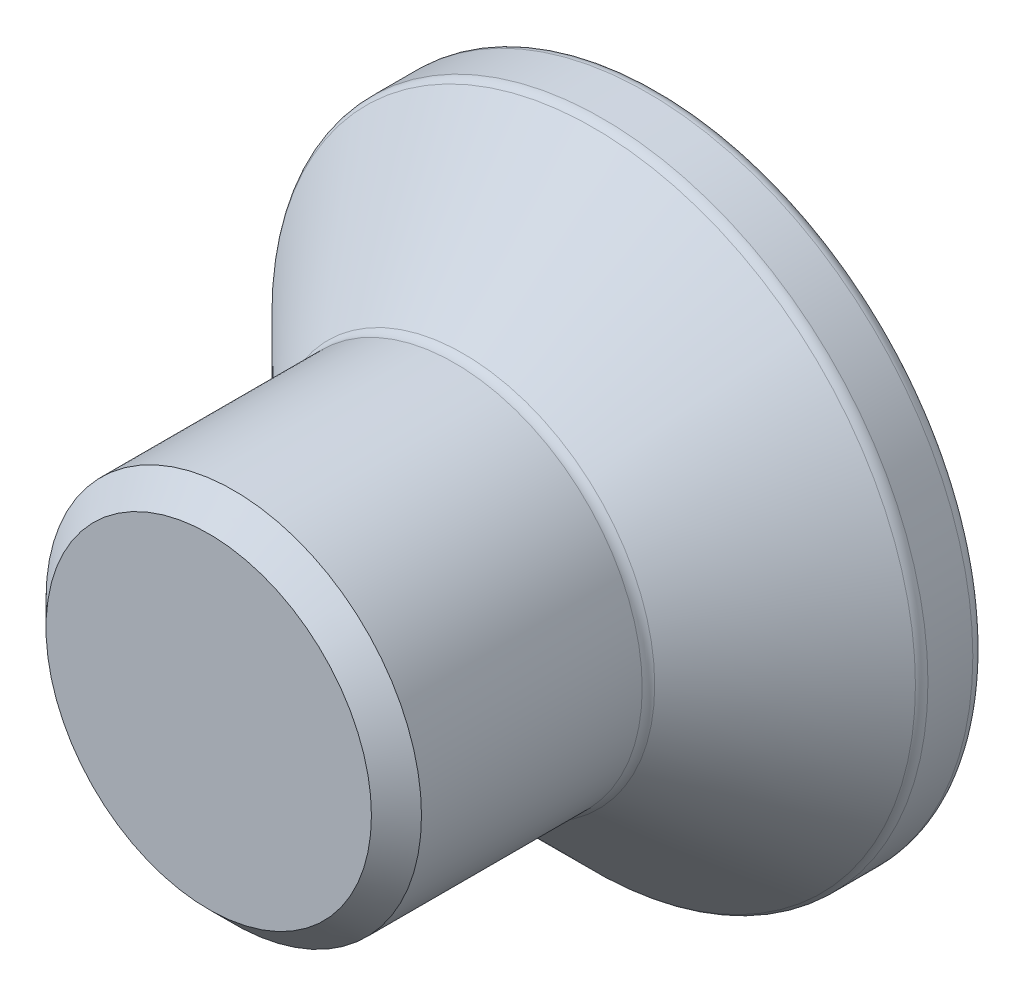
ISO-10303-21;
HEADER;
FILE_DESCRIPTION(('STEP AP214'),'2;1');
FILE_NAME('part.step','',(''),(''),'','','');
FILE_SCHEMA(('AUTOMOTIVE_DESIGN { 1 0 10303 214 1 1 1 1 }'));
ENDSEC;
DATA;
#1=APPLICATION_CONTEXT('core data for automotive mechanical design processes');
#2=APPLICATION_PROTOCOL_DEFINITION('international standard','automotive_design',2000,#1);
#3=PRODUCT_CONTEXT('',#1,'mechanical');
#4=PRODUCT('Part','Part','',(#3));
#5=PRODUCT_RELATED_PRODUCT_CATEGORY('part','',(#4));
#6=PRODUCT_DEFINITION_FORMATION('','',#4);
#7=PRODUCT_DEFINITION_CONTEXT('part definition',#1,'design');
#8=PRODUCT_DEFINITION('design','',#6,#7);
#9=PRODUCT_DEFINITION_SHAPE('','',#8);
#10=(LENGTH_UNIT() NAMED_UNIT(*) SI_UNIT(.MILLI.,.METRE.));
#11=(NAMED_UNIT(*) PLANE_ANGLE_UNIT() SI_UNIT($,.RADIAN.));
#12=(NAMED_UNIT(*) SI_UNIT($,.STERADIAN.) SOLID_ANGLE_UNIT());
#13=UNCERTAINTY_MEASURE_WITH_UNIT(LENGTH_MEASURE(1.E-05),#10,'distance_accuracy_value','');
#14=(GEOMETRIC_REPRESENTATION_CONTEXT(3) GLOBAL_UNCERTAINTY_ASSIGNED_CONTEXT((#13)) GLOBAL_UNIT_ASSIGNED_CONTEXT((#10,
#11,#12)) REPRESENTATION_CONTEXT('',''));
#15=CARTESIAN_POINT('',(0.,0.,0.));
#16=DIRECTION('',(0.,0.,1.));
#17=DIRECTION('',(1.,0.,0.));
#18=AXIS2_PLACEMENT_3D('',#15,#16,#17);
#19=CARTESIAN_POINT('',(0.,0.,-3.6049742328213));
#20=DIRECTION('',(0.,0.,-1.));
#21=DIRECTION('',(-1.,0.,0.));
#22=AXIS2_PLACEMENT_3D('',#19,#20,#21);
#23=PLANE('',#22);
#24=CARTESIAN_POINT('',(0.,0.,-3.6049742328213));
#25=DIRECTION('',(0.,0.,-1.));
#26=DIRECTION('',(-1.,0.,0.));
#27=AXIS2_PLACEMENT_3D('',#24,#25,#26);
#28=CIRCLE('',#27,2.5);
#29=CARTESIAN_POINT('',(-2.5,0.,-3.6049742328213));
#30=VERTEX_POINT('',#29);
#31=EDGE_CURVE('E196',#30,#30,#28,.T.);
#32=ORIENTED_EDGE('',*,*,#31,.T.);
#33=EDGE_LOOP('',(#32));
#34=FACE_BOUND('',#33,.T.);
#35=DIRECTION('',(-0.5,0.866025403784439,0.));
#36=VECTOR('',#35,1.);
#37=CARTESIAN_POINT('',(-0.75,-1.29903810567666,-3.6049742328213));
#38=LINE('',#37,#36);
#39=CARTESIAN_POINT('',(-0.75,-1.29903810567666,-3.6049742328213));
#40=VERTEX_POINT('',#39);
#41=CARTESIAN_POINT('',(-1.5,0.,-3.6049742328213));
#42=VERTEX_POINT('',#41);
#43=EDGE_CURVE('E118',#40,#42,#38,.T.);
#44=ORIENTED_EDGE('',*,*,#43,.F.);
#45=DIRECTION('',(-1.,0.,0.));
#46=VECTOR('',#45,1.);
#47=CARTESIAN_POINT('',(0.750000000000001,-1.29903810567666,-3.6049742328213));
#48=LINE('',#47,#46);
#49=CARTESIAN_POINT('',(0.750000000000001,-1.29903810567666,-3.6049742328213));
#50=VERTEX_POINT('',#49);
#51=EDGE_CURVE('E130',#50,#40,#48,.T.);
#52=ORIENTED_EDGE('',*,*,#51,.F.);
#53=DIRECTION('',(-0.5,-0.866025403784439,0.));
#54=VECTOR('',#53,1.);
#55=CARTESIAN_POINT('',(1.5,0.,-3.6049742328213));
#56=LINE('',#55,#54);
#57=CARTESIAN_POINT('',(1.5,0.,-3.6049742328213));
#58=VERTEX_POINT('',#57);
#59=EDGE_CURVE('E124',#58,#50,#56,.T.);
#60=ORIENTED_EDGE('',*,*,#59,.F.);
#61=DIRECTION('',(0.5,-0.866025403784439,0.));
#62=VECTOR('',#61,1.);
#63=CARTESIAN_POINT('',(0.75,1.29903810567666,-3.6049742328213));
#64=LINE('',#63,#62);
#65=CARTESIAN_POINT('',(0.75,1.29903810567666,-3.6049742328213));
#66=VERTEX_POINT('',#65);
#67=EDGE_CURVE('E122',#66,#58,#64,.T.);
#68=ORIENTED_EDGE('',*,*,#67,.F.);
#69=DIRECTION('',(1.,0.,0.));
#70=VECTOR('',#69,1.);
#71=CARTESIAN_POINT('',(-0.75,1.29903810567666,-3.6049742328213));
#72=LINE('',#71,#70);
#73=CARTESIAN_POINT('',(-0.75,1.29903810567666,-3.6049742328213));
#74=VERTEX_POINT('',#73);
#75=EDGE_CURVE('E106',#74,#66,#72,.T.);
#76=ORIENTED_EDGE('',*,*,#75,.F.);
#77=DIRECTION('',(0.5,0.866025403784439,0.));
#78=VECTOR('',#77,1.);
#79=CARTESIAN_POINT('',(-1.5,0.,-3.6049742328213));
#80=LINE('',#79,#78);
#81=EDGE_CURVE('E113',#42,#74,#80,.T.);
#82=ORIENTED_EDGE('',*,*,#81,.F.);
#83=EDGE_LOOP('',(#44,#52,#60,#68,#76,#82));
#84=FACE_BOUND('',#83,.T.);
#85=ADVANCED_FACE('F32',(#34,#84),#23,.T.);
#86=CARTESIAN_POINT('',(0.,0.,0.));
#87=DIRECTION('',(0.,0.,1.));
#88=DIRECTION('',(1.,0.,0.));
#89=AXIS2_PLACEMENT_3D('',#86,#87,#88);
#90=CYLINDRICAL_SURFACE('',#89,2.6);
#91=CARTESIAN_POINT('',(0.,0.,-3.14639558905861));
#92=DIRECTION('',(0.,0.,-1.));
#93=DIRECTION('',(-1.,0.,0.));
#94=AXIS2_PLACEMENT_3D('',#91,#92,#93);
#95=CIRCLE('',#94,2.6);
#96=CARTESIAN_POINT('',(-2.6,0.,-3.14639558905861));
#97=VERTEX_POINT('',#96);
#98=EDGE_CURVE('E193',#97,#97,#95,.T.);
#99=ORIENTED_EDGE('',*,*,#98,.T.);
#100=EDGE_LOOP('',(#99));
#101=FACE_BOUND('',#100,.T.);
#102=CARTESIAN_POINT('',(0.,0.,-3.5049742328213));
#103=DIRECTION('',(0.,0.,-1.));
#104=DIRECTION('',(-1.,0.,0.));
#105=AXIS2_PLACEMENT_3D('',#102,#103,#104);
#106=CIRCLE('',#105,2.6);
#107=CARTESIAN_POINT('',(-2.6,0.,-3.5049742328213));
#108=VERTEX_POINT('',#107);
#109=EDGE_CURVE('E190',#108,#108,#106,.F.);
#110=ORIENTED_EDGE('',*,*,#109,.T.);
#111=EDGE_LOOP('',(#110));
#112=FACE_BOUND('',#111,.T.);
#113=ADVANCED_FACE('F213',(#101,#112),#90,.T.);
#114=CARTESIAN_POINT('',(0.,0.,-2.00497423282132));
#115=DIRECTION('',(0.,0.,-1.));
#116=DIRECTION('',(-1.,0.,0.));
#117=AXIS2_PLACEMENT_3D('',#114,#115,#116);
#118=CONICAL_SURFACE('',#117,1.5,0.785398163397453);
#119=CARTESIAN_POINT('',(0.,0.,-2.03426355470266));
#120=DIRECTION('',(0.,0.,-1.));
#121=DIRECTION('',(-1.,0.,0.));
#122=AXIS2_PLACEMENT_3D('',#119,#120,#121);
#123=CIRCLE('',#122,1.52928932188135);
#124=CARTESIAN_POINT('',(-1.52928932188135,0.,-2.03426355470266));
#125=VERTEX_POINT('',#124);
#126=EDGE_CURVE('E187',#125,#125,#123,.T.);
#127=ORIENTED_EDGE('',*,*,#126,.T.);
#128=EDGE_LOOP('',(#127));
#129=FACE_BOUND('',#128,.T.);
#130=CARTESIAN_POINT('',(0.,0.,-3.07568491093996));
#131=DIRECTION('',(0.,0.,1.));
#132=DIRECTION('',(1.,0.,0.));
#133=AXIS2_PLACEMENT_3D('',#130,#131,#132);
#134=CIRCLE('',#133,2.57071067811865);
#135=CARTESIAN_POINT('',(2.57071067811865,0.,-3.07568491093996));
#136=VERTEX_POINT('',#135);
#137=EDGE_CURVE('E184',#136,#136,#134,.T.);
#138=ORIENTED_EDGE('',*,*,#137,.T.);
#139=EDGE_LOOP('',(#138));
#140=FACE_BOUND('',#139,.T.);
#141=ADVANCED_FACE('F219',(#129,#140),#118,.T.);
#142=CARTESIAN_POINT('',(0.,0.,0.));
#143=DIRECTION('',(0.,0.,1.));
#144=DIRECTION('',(1.,0.,0.));
#145=AXIS2_PLACEMENT_3D('',#142,#143,#144);
#146=CYLINDRICAL_SURFACE('',#145,1.5);
#147=CARTESIAN_POINT('',(0.,0.,-0.199999999999999));
#148=DIRECTION('',(0.,0.,1.));
#149=DIRECTION('',(1.,0.,0.));
#150=AXIS2_PLACEMENT_3D('',#147,#148,#149);
#151=CIRCLE('',#150,1.5);
#152=CARTESIAN_POINT('',(1.5,0.,-0.199999999999999));
#153=VERTEX_POINT('',#152);
#154=EDGE_CURVE('E11',#153,#153,#151,.F.);
#155=ORIENTED_EDGE('',*,*,#154,.T.);
#156=EDGE_LOOP('',(#155));
#157=FACE_BOUND('',#156,.T.);
#158=CARTESIAN_POINT('',(0.,0.,-1.96355287658401));
#159=DIRECTION('',(0.,0.,1.));
#160=DIRECTION('',(1.,0.,0.));
#161=AXIS2_PLACEMENT_3D('',#158,#159,#160);
#162=CIRCLE('',#161,1.5);
#163=CARTESIAN_POINT('',(1.5,0.,-1.96355287658401));
#164=VERTEX_POINT('',#163);
#165=EDGE_CURVE('E165',#164,#164,#162,.T.);
#166=ORIENTED_EDGE('',*,*,#165,.T.);
#167=EDGE_LOOP('',(#166));
#168=FACE_BOUND('',#167,.T.);
#169=ADVANCED_FACE('F262',(#157,#168),#146,.T.);
#170=CARTESIAN_POINT('',(1.5,0.,0.));
#171=DIRECTION('',(0.,0.,1.));
#172=DIRECTION('',(1.,0.,0.));
#173=AXIS2_PLACEMENT_3D('',#170,#171,#172);
#174=PLANE('',#173);
#175=CARTESIAN_POINT('',(0.,0.,0.));
#176=DIRECTION('',(0.,0.,1.));
#177=DIRECTION('',(1.,0.,0.));
#178=AXIS2_PLACEMENT_3D('',#175,#176,#177);
#179=CIRCLE('',#178,1.3);
#180=CARTESIAN_POINT('',(1.3,0.,0.));
#181=VERTEX_POINT('',#180);
#182=EDGE_CURVE('E40',#181,#181,#179,.T.);
#183=ORIENTED_EDGE('',*,*,#182,.T.);
#184=EDGE_LOOP('',(#183));
#185=FACE_BOUND('',#184,.T.);
#186=ADVANCED_FACE('F201',(#185),#174,.T.);
#187=CARTESIAN_POINT('',(-0.75,-1.29903810567666,-2.6049742328213));
#188=DIRECTION('',(-0.866025403784439,-0.5,0.));
#189=DIRECTION('',(0.5,-0.866025403784439,0.));
#190=AXIS2_PLACEMENT_3D('',#187,#188,#189);
#191=PLANE('',#190);
#192=DIRECTION('',(0.,0.,-1.));
#193=VECTOR('',#192,1.);
#194=CARTESIAN_POINT('',(-1.5,0.,-2.6049742328213));
#195=LINE('',#194,#193);
#196=CARTESIAN_POINT('',(-1.5,0.,-3.1049742328213));
#197=VERTEX_POINT('',#196);
#198=EDGE_CURVE('E110',#197,#42,#195,.T.);
#199=ORIENTED_EDGE('',*,*,#198,.F.);
#200=DIRECTION('',(0.5,-0.866025403784439,0.));
#201=VECTOR('',#200,1.);
#202=CARTESIAN_POINT('',(-0.75,-1.29903810567666,-3.1049742328213));
#203=LINE('',#202,#201);
#204=CARTESIAN_POINT('',(-0.75,-1.29903810567666,-3.1049742328213));
#205=VERTEX_POINT('',#204);
#206=EDGE_CURVE('E163',#197,#205,#203,.T.);
#207=ORIENTED_EDGE('',*,*,#206,.T.);
#208=DIRECTION('',(0.,0.,-1.));
#209=VECTOR('',#208,1.);
#210=CARTESIAN_POINT('',(-0.75,-1.29903810567666,-2.6049742328213));
#211=LINE('',#210,#209);
#212=EDGE_CURVE('E133',#205,#40,#211,.T.);
#213=ORIENTED_EDGE('',*,*,#212,.T.);
#214=ORIENTED_EDGE('',*,*,#43,.T.);
#215=EDGE_LOOP('',(#199,#207,#213,#214));
#216=FACE_BOUND('',#215,.T.);
#217=ADVANCED_FACE('F272',(#216),#191,.F.);
#218=CARTESIAN_POINT('',(0.750000000000001,-1.29903810567666,-2.6049742328213));
#219=DIRECTION('',(0.,-1.,0.));
#220=DIRECTION('',(1.,0.,0.));
#221=AXIS2_PLACEMENT_3D('',#218,#219,#220);
#222=PLANE('',#221);
#223=ORIENTED_EDGE('',*,*,#212,.F.);
#224=DIRECTION('',(1.,0.,0.));
#225=VECTOR('',#224,1.);
#226=CARTESIAN_POINT('',(0.750000000000001,-1.29903810567666,-3.1049742328213));
#227=LINE('',#226,#225);
#228=CARTESIAN_POINT('',(0.750000000000001,-1.29903810567666,-3.1049742328213));
#229=VERTEX_POINT('',#228);
#230=EDGE_CURVE('E154',#205,#229,#227,.T.);
#231=ORIENTED_EDGE('',*,*,#230,.T.);
#232=DIRECTION('',(0.,0.,-1.));
#233=VECTOR('',#232,1.);
#234=CARTESIAN_POINT('',(0.750000000000001,-1.29903810567666,-2.6049742328213));
#235=LINE('',#234,#233);
#236=EDGE_CURVE('E136',#229,#50,#235,.T.);
#237=ORIENTED_EDGE('',*,*,#236,.T.);
#238=ORIENTED_EDGE('',*,*,#51,.T.);
#239=EDGE_LOOP('',(#223,#231,#237,#238));
#240=FACE_BOUND('',#239,.T.);
#241=ADVANCED_FACE('F275',(#240),#222,.F.);
#242=CARTESIAN_POINT('',(1.5,0.,-2.6049742328213));
#243=DIRECTION('',(0.866025403784439,-0.5,0.));
#244=DIRECTION('',(0.5,0.866025403784439,0.));
#245=AXIS2_PLACEMENT_3D('',#242,#243,#244);
#246=PLANE('',#245);
#247=ORIENTED_EDGE('',*,*,#236,.F.);
#248=DIRECTION('',(0.5,0.866025403784439,0.));
#249=VECTOR('',#248,1.);
#250=CARTESIAN_POINT('',(1.5,0.,-3.1049742328213));
#251=LINE('',#250,#249);
#252=CARTESIAN_POINT('',(1.5,0.,-3.1049742328213));
#253=VERTEX_POINT('',#252);
#254=EDGE_CURVE('E157',#229,#253,#251,.T.);
#255=ORIENTED_EDGE('',*,*,#254,.T.);
#256=DIRECTION('',(0.,0.,-1.));
#257=VECTOR('',#256,1.);
#258=CARTESIAN_POINT('',(1.5,0.,-2.6049742328213));
#259=LINE('',#258,#257);
#260=EDGE_CURVE('E138',#253,#58,#259,.T.);
#261=ORIENTED_EDGE('',*,*,#260,.T.);
#262=ORIENTED_EDGE('',*,*,#59,.T.);
#263=EDGE_LOOP('',(#247,#255,#261,#262));
#264=FACE_BOUND('',#263,.T.);
#265=ADVANCED_FACE('F284',(#264),#246,.F.);
#266=CARTESIAN_POINT('',(0.75,1.29903810567666,-2.6049742328213));
#267=DIRECTION('',(0.866025403784439,0.5,0.));
#268=DIRECTION('',(-0.5,0.866025403784439,0.));
#269=AXIS2_PLACEMENT_3D('',#266,#267,#268);
#270=PLANE('',#269);
#271=ORIENTED_EDGE('',*,*,#260,.F.);
#272=DIRECTION('',(-0.5,0.866025403784439,0.));
#273=VECTOR('',#272,1.);
#274=CARTESIAN_POINT('',(0.75,1.29903810567666,-3.1049742328213));
#275=LINE('',#274,#273);
#276=CARTESIAN_POINT('',(0.75,1.29903810567666,-3.1049742328213));
#277=VERTEX_POINT('',#276);
#278=EDGE_CURVE('E159',#253,#277,#275,.T.);
#279=ORIENTED_EDGE('',*,*,#278,.T.);
#280=DIRECTION('',(0.,0.,-1.));
#281=VECTOR('',#280,1.);
#282=CARTESIAN_POINT('',(0.75,1.29903810567666,-2.6049742328213));
#283=LINE('',#282,#281);
#284=EDGE_CURVE('E109',#277,#66,#283,.T.);
#285=ORIENTED_EDGE('',*,*,#284,.T.);
#286=ORIENTED_EDGE('',*,*,#67,.T.);
#287=EDGE_LOOP('',(#271,#279,#285,#286));
#288=FACE_BOUND('',#287,.T.);
#289=ADVANCED_FACE('F281',(#288),#270,.F.);
#290=CARTESIAN_POINT('',(-0.75,1.29903810567666,-2.6049742328213));
#291=DIRECTION('',(0.,1.,0.));
#292=DIRECTION('',(0.,0.,1.));
#293=AXIS2_PLACEMENT_3D('',#290,#291,#292);
#294=PLANE('',#293);
#295=ORIENTED_EDGE('',*,*,#284,.F.);
#296=DIRECTION('',(-1.,0.,0.));
#297=VECTOR('',#296,1.);
#298=CARTESIAN_POINT('',(-0.75,1.29903810567666,-3.1049742328213));
#299=LINE('',#298,#297);
#300=CARTESIAN_POINT('',(-0.75,1.29903810567666,-3.1049742328213));
#301=VERTEX_POINT('',#300);
#302=EDGE_CURVE('E55',#277,#301,#299,.T.);
#303=ORIENTED_EDGE('',*,*,#302,.T.);
#304=DIRECTION('',(0.,0.,-1.));
#305=VECTOR('',#304,1.);
#306=CARTESIAN_POINT('',(-0.75,1.29903810567666,-2.6049742328213));
#307=LINE('',#306,#305);
#308=EDGE_CURVE('E102',#301,#74,#307,.T.);
#309=ORIENTED_EDGE('',*,*,#308,.T.);
#310=ORIENTED_EDGE('',*,*,#75,.T.);
#311=EDGE_LOOP('',(#295,#303,#309,#310));
#312=FACE_BOUND('',#311,.T.);
#313=ADVANCED_FACE('F104',(#312),#294,.F.);
#314=CARTESIAN_POINT('',(-1.5,0.,-2.6049742328213));
#315=DIRECTION('',(-0.866025403784439,0.5,0.));
#316=DIRECTION('',(-0.5,-0.866025403784439,0.));
#317=AXIS2_PLACEMENT_3D('',#314,#315,#316);
#318=PLANE('',#317);
#319=ORIENTED_EDGE('',*,*,#308,.F.);
#320=DIRECTION('',(-0.5,-0.866025403784439,0.));
#321=VECTOR('',#320,1.);
#322=CARTESIAN_POINT('',(-1.5,0.,-3.1049742328213));
#323=LINE('',#322,#321);
#324=EDGE_CURVE('E47',#301,#197,#323,.T.);
#325=ORIENTED_EDGE('',*,*,#324,.T.);
#326=ORIENTED_EDGE('',*,*,#198,.T.);
#327=ORIENTED_EDGE('',*,*,#81,.T.);
#328=EDGE_LOOP('',(#319,#325,#326,#327));
#329=FACE_BOUND('',#328,.T.);
#330=ADVANCED_FACE('F114',(#329),#318,.F.);
#331=CARTESIAN_POINT('',(0.,0.,-2.6049742328213));
#332=DIRECTION('',(0.,0.,-1.));
#333=DIRECTION('',(-1.,0.,0.));
#334=AXIS2_PLACEMENT_3D('',#331,#332,#333);
#335=PLANE('',#334);
#336=DIRECTION('',(-0.5,-0.866025403784439,0.));
#337=VECTOR('',#336,1.);
#338=CARTESIAN_POINT('',(0.691987298107779,-0.399519052838328,-2.6049742328213));
#339=LINE('',#338,#337);
#340=CARTESIAN_POINT('',(0.922649730810372,0.,-2.6049742328213));
#341=VERTEX_POINT('',#340);
#342=CARTESIAN_POINT('',(0.461324865405186,-0.799038105676656,-2.6049742328213));
#343=VERTEX_POINT('',#342);
#344=EDGE_CURVE('E149',#341,#343,#339,.T.);
#345=ORIENTED_EDGE('',*,*,#344,.T.);
#346=DIRECTION('',(-1.,0.,0.));
#347=VECTOR('',#346,1.);
#348=CARTESIAN_POINT('',(0.,-0.799038105676656,-2.6049742328213));
#349=LINE('',#348,#347);
#350=CARTESIAN_POINT('',(-0.461324865405185,-0.799038105676656,-2.6049742328213));
#351=VERTEX_POINT('',#350);
#352=EDGE_CURVE('E151',#343,#351,#349,.T.);
#353=ORIENTED_EDGE('',*,*,#352,.T.);
#354=DIRECTION('',(-0.5,0.866025403784439,0.));
#355=VECTOR('',#354,1.);
#356=CARTESIAN_POINT('',(-0.691987298107778,-0.399519052838327,-2.6049742328213));
#357=LINE('',#356,#355);
#358=CARTESIAN_POINT('',(-0.92264973081037,0.,-2.6049742328213));
#359=VERTEX_POINT('',#358);
#360=EDGE_CURVE('E135',#351,#359,#357,.T.);
#361=ORIENTED_EDGE('',*,*,#360,.T.);
#362=DIRECTION('',(0.5,0.866025403784439,0.));
#363=VECTOR('',#362,1.);
#364=CARTESIAN_POINT('',(-0.691987298107778,0.399519052838327,-2.6049742328213));
#365=LINE('',#364,#363);
#366=CARTESIAN_POINT('',(-0.461324865405185,0.799038105676656,-2.6049742328213));
#367=VERTEX_POINT('',#366);
#368=EDGE_CURVE('E143',#359,#367,#365,.T.);
#369=ORIENTED_EDGE('',*,*,#368,.T.);
#370=DIRECTION('',(1.,0.,0.));
#371=VECTOR('',#370,1.);
#372=CARTESIAN_POINT('',(0.,0.799038105676656,-2.6049742328213));
#373=LINE('',#372,#371);
#374=CARTESIAN_POINT('',(0.461324865405186,0.799038105676656,-2.6049742328213));
#375=VERTEX_POINT('',#374);
#376=EDGE_CURVE('E145',#367,#375,#373,.T.);
#377=ORIENTED_EDGE('',*,*,#376,.T.);
#378=DIRECTION('',(0.5,-0.866025403784439,0.));
#379=VECTOR('',#378,1.);
#380=CARTESIAN_POINT('',(0.691987298107779,0.399519052838328,-2.6049742328213));
#381=LINE('',#380,#379);
#382=EDGE_CURVE('E147',#375,#341,#381,.T.);
#383=ORIENTED_EDGE('',*,*,#382,.T.);
#384=EDGE_LOOP('',(#345,#353,#361,#369,#377,#383));
#385=FACE_BOUND('',#384,.T.);
#386=ADVANCED_FACE('F248',(#385),#335,.T.);
#387=CARTESIAN_POINT('',(0.,0.799038105676656,-2.6049742328213));
#388=DIRECTION('',(0.,0.707106781186544,0.707106781186551));
#389=DIRECTION('',(1.,0.,0.));
#390=AXIS2_PLACEMENT_3D('',#387,#388,#389);
#391=PLANE('',#390);
#392=DIRECTION('',(0.377964473009229,-0.65465367070798,0.654653670707973));
#393=VECTOR('',#392,1.);
#394=CARTESIAN_POINT('',(-0.395421313204443,0.684889804865704,-2.49082593201035));
#395=LINE('',#394,#393);
#396=EDGE_CURVE('E176',#301,#367,#395,.T.);
#397=ORIENTED_EDGE('',*,*,#396,.F.);
#398=ORIENTED_EDGE('',*,*,#302,.F.);
#399=DIRECTION('',(-0.377964473009229,-0.65465367070798,0.654653670707973));
#400=VECTOR('',#399,1.);
#401=CARTESIAN_POINT('',(0.395421313204444,0.684889804865704,-2.49082593201035));
#402=LINE('',#401,#400);
#403=EDGE_CURVE('E179',#375,#277,#402,.F.);
#404=ORIENTED_EDGE('',*,*,#403,.F.);
#405=ORIENTED_EDGE('',*,*,#376,.F.);
#406=EDGE_LOOP('',(#397,#398,#404,#405));
#407=FACE_BOUND('',#406,.T.);
#408=ADVANCED_FACE('F244',(#407),#391,.F.);
#409=CARTESIAN_POINT('',(0.691987298107779,0.399519052838328,-2.6049742328213));
#410=DIRECTION('',(0.612372435695791,0.353553390593272,0.707106781186551));
#411=DIRECTION('',(0.5,-0.866025403784439,0.));
#412=AXIS2_PLACEMENT_3D('',#409,#410,#411);
#413=PLANE('',#412);
#414=ORIENTED_EDGE('',*,*,#403,.T.);
#415=ORIENTED_EDGE('',*,*,#278,.F.);
#416=DIRECTION('',(-0.755928946018458,0.,0.654653670707973));
#417=VECTOR('',#416,1.);
#418=CARTESIAN_POINT('',(0.790842626408889,0.,-2.49082593201035));
#419=LINE('',#418,#417);
#420=EDGE_CURVE('E173',#341,#253,#419,.F.);
#421=ORIENTED_EDGE('',*,*,#420,.F.);
#422=ORIENTED_EDGE('',*,*,#382,.F.);
#423=EDGE_LOOP('',(#414,#415,#421,#422));
#424=FACE_BOUND('',#423,.T.);
#425=ADVANCED_FACE('F240',(#424),#413,.F.);
#426=CARTESIAN_POINT('',(-0.691987298107778,0.399519052838327,-2.6049742328213));
#427=DIRECTION('',(-0.612372435695791,0.353553390593272,0.707106781186551));
#428=DIRECTION('',(0.5,0.866025403784439,0.));
#429=AXIS2_PLACEMENT_3D('',#426,#427,#428);
#430=PLANE('',#429);
#431=ORIENTED_EDGE('',*,*,#396,.T.);
#432=ORIENTED_EDGE('',*,*,#368,.F.);
#433=DIRECTION('',(0.755928946018458,0.,0.654653670707973));
#434=VECTOR('',#433,1.);
#435=CARTESIAN_POINT('',(-0.790842626408888,0.,-2.49082593201035));
#436=LINE('',#435,#434);
#437=EDGE_CURVE('E170',#197,#359,#436,.T.);
#438=ORIENTED_EDGE('',*,*,#437,.F.);
#439=ORIENTED_EDGE('',*,*,#324,.F.);
#440=EDGE_LOOP('',(#431,#432,#438,#439));
#441=FACE_BOUND('',#440,.T.);
#442=ADVANCED_FACE('F236',(#441),#430,.F.);
#443=CARTESIAN_POINT('',(0.691987298107779,-0.399519052838328,-2.6049742328213));
#444=DIRECTION('',(0.612372435695791,-0.353553390593272,0.707106781186551));
#445=DIRECTION('',(-0.5,-0.866025403784439,0.));
#446=AXIS2_PLACEMENT_3D('',#443,#444,#445);
#447=PLANE('',#446);
#448=ORIENTED_EDGE('',*,*,#420,.T.);
#449=ORIENTED_EDGE('',*,*,#254,.F.);
#450=DIRECTION('',(-0.377964473009229,0.65465367070798,0.654653670707973));
#451=VECTOR('',#450,1.);
#452=CARTESIAN_POINT('',(0.395421313204445,-0.684889804865704,-2.49082593201035));
#453=LINE('',#452,#451);
#454=EDGE_CURVE('E168',#343,#229,#453,.F.);
#455=ORIENTED_EDGE('',*,*,#454,.F.);
#456=ORIENTED_EDGE('',*,*,#344,.F.);
#457=EDGE_LOOP('',(#448,#449,#455,#456));
#458=FACE_BOUND('',#457,.T.);
#459=ADVANCED_FACE('F232',(#458),#447,.F.);
#460=CARTESIAN_POINT('',(-0.691987298107778,-0.399519052838327,-2.6049742328213));
#461=DIRECTION('',(-0.612372435695791,-0.353553390593272,0.707106781186551));
#462=DIRECTION('',(-0.5,0.866025403784439,0.));
#463=AXIS2_PLACEMENT_3D('',#460,#461,#462);
#464=PLANE('',#463);
#465=ORIENTED_EDGE('',*,*,#437,.T.);
#466=ORIENTED_EDGE('',*,*,#360,.F.);
#467=DIRECTION('',(-0.377964473009229,-0.65465367070798,-0.654653670707973));
#468=VECTOR('',#467,1.);
#469=CARTESIAN_POINT('',(-0.395421313204444,-0.684889804865704,-2.49082593201035));
#470=LINE('',#469,#468);
#471=EDGE_CURVE('E166',#205,#351,#470,.F.);
#472=ORIENTED_EDGE('',*,*,#471,.F.);
#473=ORIENTED_EDGE('',*,*,#206,.F.);
#474=EDGE_LOOP('',(#465,#466,#472,#473));
#475=FACE_BOUND('',#474,.T.);
#476=ADVANCED_FACE('F228',(#475),#464,.F.);
#477=CARTESIAN_POINT('',(0.,-0.799038105676656,-2.6049742328213));
#478=DIRECTION('',(0.,-0.707106781186544,0.707106781186551));
#479=DIRECTION('',(-1.,0.,0.));
#480=AXIS2_PLACEMENT_3D('',#477,#478,#479);
#481=PLANE('',#480);
#482=ORIENTED_EDGE('',*,*,#454,.T.);
#483=ORIENTED_EDGE('',*,*,#230,.F.);
#484=ORIENTED_EDGE('',*,*,#471,.T.);
#485=ORIENTED_EDGE('',*,*,#352,.F.);
#486=EDGE_LOOP('',(#482,#483,#484,#485));
#487=FACE_BOUND('',#486,.T.);
#488=ADVANCED_FACE('F224',(#487),#481,.F.);
#489=CARTESIAN_POINT('',(0.,0.,-1.96355287658401));
#490=DIRECTION('',(0.,0.,1.));
#491=DIRECTION('',(1.,0.,0.));
#492=AXIS2_PLACEMENT_3D('',#489,#490,#491);
#493=TOROIDAL_SURFACE('',#492,1.6,0.1);
#494=ORIENTED_EDGE('',*,*,#126,.F.);
#495=EDGE_LOOP('',(#494));
#496=FACE_BOUND('',#495,.T.);
#497=ORIENTED_EDGE('',*,*,#165,.F.);
#498=EDGE_LOOP('',(#497));
#499=FACE_BOUND('',#498,.T.);
#500=ADVANCED_FACE('F227',(#496,#499),#493,.F.);
#501=CARTESIAN_POINT('',(0.,0.,-3.14639558905861));
#502=DIRECTION('',(0.,0.,-1.));
#503=DIRECTION('',(-1.,0.,0.));
#504=AXIS2_PLACEMENT_3D('',#501,#502,#503);
#505=TOROIDAL_SURFACE('',#504,2.5,0.1);
#506=ORIENTED_EDGE('',*,*,#98,.F.);
#507=EDGE_LOOP('',(#506));
#508=FACE_BOUND('',#507,.T.);
#509=ORIENTED_EDGE('',*,*,#137,.F.);
#510=EDGE_LOOP('',(#509));
#511=FACE_BOUND('',#510,.T.);
#512=ADVANCED_FACE('F209',(#508,#511),#505,.T.);
#513=CARTESIAN_POINT('',(0.,0.,-3.5049742328213));
#514=DIRECTION('',(0.,0.,-1.));
#515=DIRECTION('',(-1.,0.,0.));
#516=AXIS2_PLACEMENT_3D('',#513,#514,#515);
#517=TOROIDAL_SURFACE('',#516,2.5,0.1);
#518=ORIENTED_EDGE('',*,*,#31,.F.);
#519=EDGE_LOOP('',(#518));
#520=FACE_BOUND('',#519,.T.);
#521=ORIENTED_EDGE('',*,*,#109,.F.);
#522=EDGE_LOOP('',(#521));
#523=FACE_BOUND('',#522,.T.);
#524=ADVANCED_FACE('F204',(#520,#523),#517,.T.);
#525=CARTESIAN_POINT('',(0.,0.,0.));
#526=DIRECTION('',(0.,0.,-1.));
#527=DIRECTION('',(-1.,0.,0.));
#528=AXIS2_PLACEMENT_3D('',#525,#526,#527);
#529=CONICAL_SURFACE('',#528,1.3,0.785398163397445);
#530=ORIENTED_EDGE('',*,*,#154,.F.);
#531=EDGE_LOOP('',(#530));
#532=FACE_BOUND('',#531,.T.);
#533=ORIENTED_EDGE('',*,*,#182,.F.);
#534=EDGE_LOOP('',(#533));
#535=FACE_BOUND('',#534,.T.);
#536=ADVANCED_FACE('F34',(#532,#535),#529,.T.);
#537=CLOSED_SHELL('',(#85,#113,#141,#169,#186,#217,#241,#265,#289,#313,#330,#386,#408,#425,#442,
#459,#476,#488,#500,#512,#524,#536));
#538=MANIFOLD_SOLID_BREP('B2',#537);
#539=ADVANCED_BREP_SHAPE_REPRESENTATION('',(#18,#538),#14);
#540=SHAPE_DEFINITION_REPRESENTATION(#9,#539);
ENDSEC;
END-ISO-10303-21;
